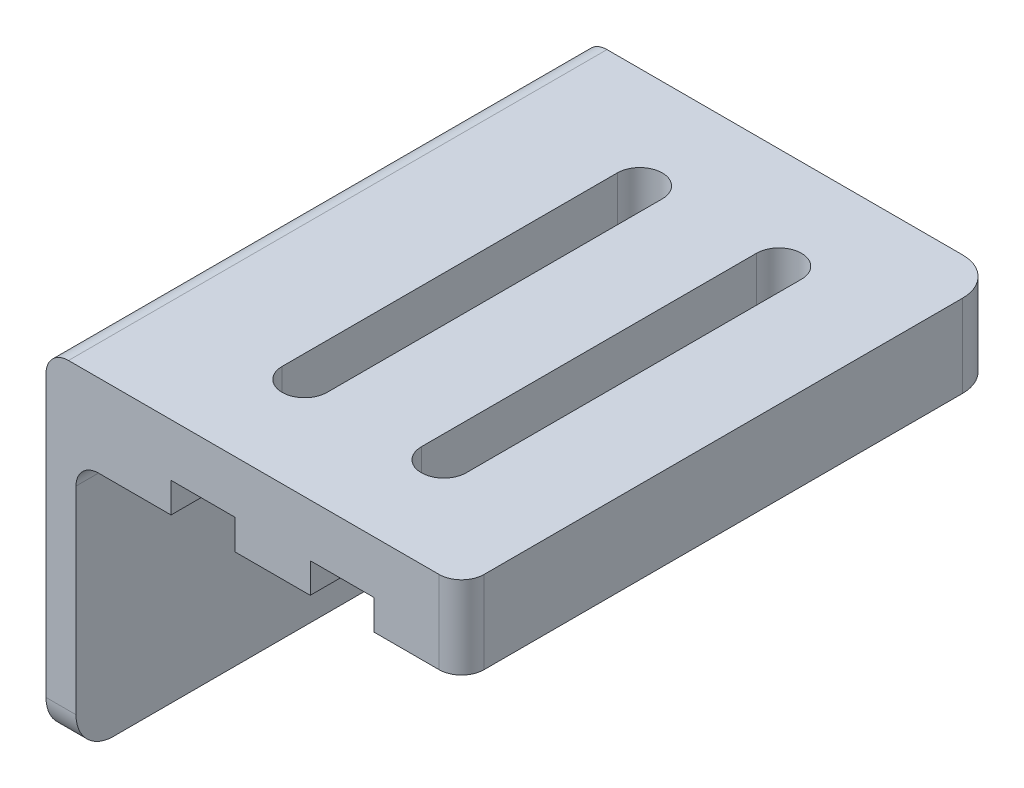
ISO-10303-21;
HEADER;
FILE_DESCRIPTION(('STEP AP214'),'2;1');
FILE_NAME('part.step','',(''),(''),'','','');
FILE_SCHEMA(('AUTOMOTIVE_DESIGN { 1 0 10303 214 1 1 1 1 }'));
ENDSEC;
DATA;
#1=APPLICATION_CONTEXT('core data for automotive mechanical design processes');
#2=APPLICATION_PROTOCOL_DEFINITION('international standard','automotive_design',2000,#1);
#3=PRODUCT_CONTEXT('',#1,'mechanical');
#4=PRODUCT('Part','Part','',(#3));
#5=PRODUCT_RELATED_PRODUCT_CATEGORY('part','',(#4));
#6=PRODUCT_DEFINITION_FORMATION('','',#4);
#7=PRODUCT_DEFINITION_CONTEXT('part definition',#1,'design');
#8=PRODUCT_DEFINITION('design','',#6,#7);
#9=PRODUCT_DEFINITION_SHAPE('','',#8);
#10=(LENGTH_UNIT() NAMED_UNIT(*) SI_UNIT(.MILLI.,.METRE.));
#11=(NAMED_UNIT(*) PLANE_ANGLE_UNIT() SI_UNIT($,.RADIAN.));
#12=(NAMED_UNIT(*) SI_UNIT($,.STERADIAN.) SOLID_ANGLE_UNIT());
#13=UNCERTAINTY_MEASURE_WITH_UNIT(LENGTH_MEASURE(1.E-05),#10,'distance_accuracy_value','');
#14=(GEOMETRIC_REPRESENTATION_CONTEXT(3) GLOBAL_UNCERTAINTY_ASSIGNED_CONTEXT((#13)) GLOBAL_UNIT_ASSIGNED_CONTEXT((#10,
#11,#12)) REPRESENTATION_CONTEXT('',''));
#15=CARTESIAN_POINT('',(0.,0.,0.));
#16=DIRECTION('',(0.,0.,1.));
#17=DIRECTION('',(1.,0.,0.));
#18=AXIS2_PLACEMENT_3D('',#15,#16,#17);
#19=CARTESIAN_POINT('',(153.6,-155.500000000001,0.));
#20=DIRECTION('',(0.,-1.,0.));
#21=DIRECTION('',(0.,0.,-1.));
#22=AXIS2_PLACEMENT_3D('',#19,#20,#21);
#23=PLANE('',#22);
#24=DIRECTION('',(1.,0.,0.));
#25=VECTOR('',#24,1.);
#26=CARTESIAN_POINT('',(144.6,-155.500000000001,56.0614389565943));
#27=LINE('',#26,#25);
#28=CARTESIAN_POINT('',(96.2,-155.500000000001,56.0614389565943));
#29=VERTEX_POINT('',#28);
#30=CARTESIAN_POINT('',(105.872209529196,-155.500000000001,56.0614389565944));
#31=VERTEX_POINT('',#30);
#32=EDGE_CURVE('E419',#29,#31,#27,.T.);
#33=ORIENTED_EDGE('',*,*,#32,.F.);
#34=DIRECTION('',(0.,0.,1.));
#35=VECTOR('',#34,1.);
#36=CARTESIAN_POINT('',(96.2,-155.500000000001,0.));
#37=LINE('',#36,#35);
#38=CARTESIAN_POINT('',(96.2,-155.500000000001,-15.7255205945389));
#39=VERTEX_POINT('',#38);
#40=EDGE_CURVE('E443',#29,#39,#37,.F.);
#41=ORIENTED_EDGE('',*,*,#40,.T.);
#42=DIRECTION('',(-1.,0.,0.));
#43=VECTOR('',#42,1.);
#44=CARTESIAN_POINT('',(153.6,-155.500000000001,-15.7255205945389));
#45=LINE('',#44,#43);
#46=CARTESIAN_POINT('',(105.872209529196,-155.500000000001,-15.7255205945389));
#47=VERTEX_POINT('',#46);
#48=EDGE_CURVE('E429',#47,#39,#45,.T.);
#49=ORIENTED_EDGE('',*,*,#48,.F.);
#50=DIRECTION('',(0.,0.,-1.));
#51=VECTOR('',#50,1.);
#52=CARTESIAN_POINT('',(105.872209529196,-155.500000000001,56.0614389565944));
#53=LINE('',#52,#51);
#54=EDGE_CURVE('E370',#31,#47,#53,.T.);
#55=ORIENTED_EDGE('',*,*,#54,.F.);
#56=EDGE_LOOP('',(#33,#41,#49,#55));
#57=FACE_BOUND('',#56,.T.);
#58=ADVANCED_FACE('F34',(#57),#23,.T.);
#59=CARTESIAN_POINT('',(93.2,0.,0.));
#60=DIRECTION('',(-1.,0.,0.));
#61=DIRECTION('',(0.,0.,1.));
#62=AXIS2_PLACEMENT_3D('',#59,#60,#61);
#63=PLANE('',#62);
#64=DIRECTION('',(0.,1.,0.));
#65=VECTOR('',#64,1.);
#66=CARTESIAN_POINT('',(93.2,-155.500000000001,56.0614389565943));
#67=LINE('',#66,#65);
#68=CARTESIAN_POINT('',(93.2,-184.900000000001,56.0614389565943));
#69=VERTEX_POINT('',#68);
#70=CARTESIAN_POINT('',(93.2,-158.500000000001,56.0614389565943));
#71=VERTEX_POINT('',#70);
#72=EDGE_CURVE('E296',#69,#71,#67,.T.);
#73=ORIENTED_EDGE('',*,*,#72,.F.);
#74=CARTESIAN_POINT('',(93.2,-184.900000000001,51.0614389565943));
#75=DIRECTION('',(-1.,0.,0.));
#76=DIRECTION('',(0.,0.,1.));
#77=AXIS2_PLACEMENT_3D('',#74,#75,#76);
#78=CIRCLE('',#77,5.);
#79=CARTESIAN_POINT('',(93.2,-189.900000000001,51.0614389565943));
#80=VERTEX_POINT('',#79);
#81=EDGE_CURVE('E42',#69,#80,#78,.F.);
#82=ORIENTED_EDGE('',*,*,#81,.T.);
#83=DIRECTION('',(0.,0.,1.));
#84=VECTOR('',#83,1.);
#85=CARTESIAN_POINT('',(93.2,-189.900000000001,26.2410464962216));
#86=LINE('',#85,#84);
#87=CARTESIAN_POINT('',(93.2,-189.900000000001,-10.7255205945389));
#88=VERTEX_POINT('',#87);
#89=EDGE_CURVE('E298',#88,#80,#86,.T.);
#90=ORIENTED_EDGE('',*,*,#89,.F.);
#91=CARTESIAN_POINT('',(93.2,-184.900000000001,-10.7255205945389));
#92=DIRECTION('',(-1.,0.,0.));
#93=DIRECTION('',(0.,0.,1.));
#94=AXIS2_PLACEMENT_3D('',#91,#92,#93);
#95=CIRCLE('',#94,5.);
#96=CARTESIAN_POINT('',(93.2,-184.900000000001,-15.7255205945389));
#97=VERTEX_POINT('',#96);
#98=EDGE_CURVE('E49',#88,#97,#95,.F.);
#99=ORIENTED_EDGE('',*,*,#98,.T.);
#100=DIRECTION('',(0.,1.,0.));
#101=VECTOR('',#100,1.);
#102=CARTESIAN_POINT('',(93.2,0.,-15.7255205945389));
#103=LINE('',#102,#101);
#104=CARTESIAN_POINT('',(93.2,-158.500000000001,-15.7255205945389));
#105=VERTEX_POINT('',#104);
#106=EDGE_CURVE('E432',#97,#105,#103,.T.);
#107=ORIENTED_EDGE('',*,*,#106,.T.);
#108=DIRECTION('',(0.,0.,1.));
#109=VECTOR('',#108,1.);
#110=CARTESIAN_POINT('',(93.2,-158.500000000001,0.));
#111=LINE('',#110,#109);
#112=EDGE_CURVE('E440',#105,#71,#111,.T.);
#113=ORIENTED_EDGE('',*,*,#112,.T.);
#114=EDGE_LOOP('',(#73,#82,#90,#99,#107,#113));
#115=FACE_BOUND('',#114,.T.);
#116=DIRECTION('',(0.,1.,0.));
#117=VECTOR('',#116,1.);
#118=CARTESIAN_POINT('',(93.2,0.,9.25776295084135));
#119=LINE('',#118,#117);
#120=CARTESIAN_POINT('',(93.2,-179.290104899113,9.25776295084138));
#121=VERTEX_POINT('',#120);
#122=CARTESIAN_POINT('',(93.2,-168.408548591911,9.25776295084138));
#123=VERTEX_POINT('',#122);
#124=EDGE_CURVE('E267',#121,#123,#119,.T.);
#125=ORIENTED_EDGE('',*,*,#124,.T.);
#126=CARTESIAN_POINT('',(93.2,-168.408548591911,5.25776295084138));
#127=DIRECTION('',(-1.,0.,0.));
#128=DIRECTION('',(0.,0.,1.));
#129=AXIS2_PLACEMENT_3D('',#126,#127,#128);
#130=CIRCLE('',#129,4.);
#131=CARTESIAN_POINT('',(93.2,-168.408548591911,1.25776295084138));
#132=VERTEX_POINT('',#131);
#133=EDGE_CURVE('E261',#123,#132,#130,.T.);
#134=ORIENTED_EDGE('',*,*,#133,.T.);
#135=DIRECTION('',(0.,-1.,0.));
#136=VECTOR('',#135,1.);
#137=CARTESIAN_POINT('',(93.2,0.,1.25776295084134));
#138=LINE('',#137,#136);
#139=CARTESIAN_POINT('',(93.2,-179.290104899113,1.25776295084138));
#140=VERTEX_POINT('',#139);
#141=EDGE_CURVE('E243',#132,#140,#138,.T.);
#142=ORIENTED_EDGE('',*,*,#141,.T.);
#143=CARTESIAN_POINT('',(93.2,-179.290104899113,5.25776295084138));
#144=DIRECTION('',(-1.,0.,0.));
#145=DIRECTION('',(0.,0.,1.));
#146=AXIS2_PLACEMENT_3D('',#143,#144,#145);
#147=CIRCLE('',#146,4.);
#148=EDGE_CURVE('E253',#140,#121,#147,.T.);
#149=ORIENTED_EDGE('',*,*,#148,.T.);
#150=EDGE_LOOP('',(#125,#134,#142,#149));
#151=FACE_BOUND('',#150,.T.);
#152=ADVANCED_FACE('F266',(#115,#151),#63,.F.);
#153=DIRECTION('',(0.,0.,-1.));
#154=VECTOR('',#153,1.);
#155=CARTESIAN_POINT('',(124.427790470804,-155.500000000001,56.0614389565944));
#156=LINE('',#155,#154);
#157=CARTESIAN_POINT('',(124.427790470804,-155.500000000001,56.0614389565944));
#158=VERTEX_POINT('',#157);
#159=CARTESIAN_POINT('',(124.427790470804,-155.500000000001,-15.7255205945389));
#160=VERTEX_POINT('',#159);
#161=EDGE_CURVE('E377',#158,#160,#156,.T.);
#162=ORIENTED_EDGE('',*,*,#161,.F.);
#163=CARTESIAN_POINT('',(114.372209529196,-155.500000000001,56.0614389565944));
#164=VERTEX_POINT('',#163);
#165=EDGE_CURVE('E422',#164,#158,#27,.T.);
#166=ORIENTED_EDGE('',*,*,#165,.F.);
#167=DIRECTION('',(0.,0.,-1.));
#168=VECTOR('',#167,1.);
#169=CARTESIAN_POINT('',(114.372209529196,-155.500000000001,56.0614389565944));
#170=LINE('',#169,#168);
#171=CARTESIAN_POINT('',(114.372209529196,-155.500000000001,-15.7255205945389));
#172=VERTEX_POINT('',#171);
#173=EDGE_CURVE('E398',#164,#172,#170,.T.);
#174=ORIENTED_EDGE('',*,*,#173,.T.);
#175=EDGE_CURVE('E433',#160,#172,#45,.T.);
#176=ORIENTED_EDGE('',*,*,#175,.F.);
#177=EDGE_LOOP('',(#162,#166,#174,#176));
#178=FACE_BOUND('',#177,.T.);
#179=ADVANCED_FACE('F558',(#178),#23,.T.);
#180=CARTESIAN_POINT('',(89.2,-144.500000000001,0.));
#181=DIRECTION('',(0.,1.,0.));
#182=DIRECTION('',(0.,0.,1.));
#183=AXIS2_PLACEMENT_3D('',#180,#181,#182);
#184=PLANE('',#183);
#185=DIRECTION('',(0.,0.,1.));
#186=VECTOR('',#185,1.);
#187=CARTESIAN_POINT('',(144.6,-144.500000000001,2.21200931382336));
#188=LINE('',#187,#186);
#189=CARTESIAN_POINT('',(144.6,-144.500000000001,-10.7255205945389));
#190=VERTEX_POINT('',#189);
#191=CARTESIAN_POINT('',(144.6,-144.500000000001,53.0614389565943));
#192=VERTEX_POINT('',#191);
#193=EDGE_CURVE('E427',#190,#192,#188,.T.);
#194=ORIENTED_EDGE('',*,*,#193,.F.);
#195=CARTESIAN_POINT('',(139.6,-144.500000000001,-10.7255205945389));
#196=DIRECTION('',(0.,1.,0.));
#197=DIRECTION('',(0.,0.,1.));
#198=AXIS2_PLACEMENT_3D('',#195,#196,#197);
#199=CIRCLE('',#198,5.);
#200=CARTESIAN_POINT('',(139.6,-144.500000000001,-15.7255205945389));
#201=VERTEX_POINT('',#200);
#202=EDGE_CURVE('E477',#190,#201,#199,.T.);
#203=ORIENTED_EDGE('',*,*,#202,.T.);
#204=DIRECTION('',(1.,0.,0.));
#205=VECTOR('',#204,1.);
#206=CARTESIAN_POINT('',(89.2,-144.500000000001,-15.7255205945389));
#207=LINE('',#206,#205);
#208=CARTESIAN_POINT('',(92.2,-144.500000000001,-15.7255205945389));
#209=VERTEX_POINT('',#208);
#210=EDGE_CURVE('E436',#209,#201,#207,.T.);
#211=ORIENTED_EDGE('',*,*,#210,.F.);
#212=DIRECTION('',(0.,0.,1.));
#213=VECTOR('',#212,1.);
#214=CARTESIAN_POINT('',(92.2,-144.500000000001,0.));
#215=LINE('',#214,#213);
#216=CARTESIAN_POINT('',(92.2,-144.500000000001,56.0614389565943));
#217=VERTEX_POINT('',#216);
#218=EDGE_CURVE('E458',#209,#217,#215,.T.);
#219=ORIENTED_EDGE('',*,*,#218,.T.);
#220=DIRECTION('',(1.,0.,0.));
#221=VECTOR('',#220,1.);
#222=CARTESIAN_POINT('',(144.6,-144.500000000001,56.0614389565943));
#223=LINE('',#222,#221);
#224=CARTESIAN_POINT('',(141.6,-144.500000000001,56.0614389565943));
#225=VERTEX_POINT('',#224);
#226=EDGE_CURVE('E418',#217,#225,#223,.T.);
#227=ORIENTED_EDGE('',*,*,#226,.T.);
#228=CARTESIAN_POINT('',(141.6,-144.500000000001,53.0614389565943));
#229=DIRECTION('',(0.,1.,0.));
#230=DIRECTION('',(0.,0.,1.));
#231=AXIS2_PLACEMENT_3D('',#228,#229,#230);
#232=CIRCLE('',#231,3.);
#233=EDGE_CURVE('E461',#225,#192,#232,.T.);
#234=ORIENTED_EDGE('',*,*,#233,.T.);
#235=EDGE_LOOP('',(#194,#203,#211,#219,#227,#234));
#236=FACE_BOUND('',#235,.T.);
#237=CARTESIAN_POINT('',(110.122209529196,-144.500000000001,-2.1725151429793));
#238=DIRECTION('',(0.,1.,0.));
#239=DIRECTION('',(0.,0.,1.));
#240=AXIS2_PLACEMENT_3D('',#237,#238,#239);
#241=CIRCLE('',#240,3.);
#242=CARTESIAN_POINT('',(113.122209529196,-144.500000000001,-2.1725151429793));
#243=VERTEX_POINT('',#242);
#244=CARTESIAN_POINT('',(107.122209529196,-144.500000000001,-2.17251514297931));
#245=VERTEX_POINT('',#244);
#246=EDGE_CURVE('E311',#243,#245,#241,.T.);
#247=ORIENTED_EDGE('',*,*,#246,.F.);
#248=DIRECTION('',(0.,0.,-1.));
#249=VECTOR('',#248,1.);
#250=CARTESIAN_POINT('',(113.122209529196,-144.500000000001,-2.1725151429793));
#251=LINE('',#250,#249);
#252=CARTESIAN_POINT('',(113.122209529196,-144.500000000001,42.5084335050348));
#253=VERTEX_POINT('',#252);
#254=EDGE_CURVE('E308',#253,#243,#251,.T.);
#255=ORIENTED_EDGE('',*,*,#254,.F.);
#256=CARTESIAN_POINT('',(110.122209529196,-144.500000000001,42.5084335050348));
#257=DIRECTION('',(0.,1.,0.));
#258=DIRECTION('',(0.,0.,1.));
#259=AXIS2_PLACEMENT_3D('',#256,#257,#258);
#260=CIRCLE('',#259,3.);
#261=CARTESIAN_POINT('',(107.122209529196,-144.500000000001,42.5084335050348));
#262=VERTEX_POINT('',#261);
#263=EDGE_CURVE('E317',#262,#253,#260,.T.);
#264=ORIENTED_EDGE('',*,*,#263,.F.);
#265=DIRECTION('',(0.,0.,1.));
#266=VECTOR('',#265,1.);
#267=CARTESIAN_POINT('',(107.122209529196,-144.500000000001,-2.17251514297931));
#268=LINE('',#267,#266);
#269=EDGE_CURVE('E320',#245,#262,#268,.T.);
#270=ORIENTED_EDGE('',*,*,#269,.F.);
#271=EDGE_LOOP('',(#247,#255,#264,#270));
#272=FACE_BOUND('',#271,.T.);
#273=CARTESIAN_POINT('',(128.677790470804,-144.500000000001,-2.17251514297931));
#274=DIRECTION('',(0.,1.,0.));
#275=DIRECTION('',(0.,0.,-1.));
#276=AXIS2_PLACEMENT_3D('',#273,#274,#275);
#277=CIRCLE('',#276,3.);
#278=CARTESIAN_POINT('',(131.677790470804,-144.500000000001,-2.17251514297931));
#279=VERTEX_POINT('',#278);
#280=CARTESIAN_POINT('',(125.677790470804,-144.500000000001,-2.17251514297931));
#281=VERTEX_POINT('',#280);
#282=EDGE_CURVE('E344',#279,#281,#277,.T.);
#283=ORIENTED_EDGE('',*,*,#282,.F.);
#284=DIRECTION('',(0.,0.,-1.));
#285=VECTOR('',#284,1.);
#286=CARTESIAN_POINT('',(131.677790470804,-144.500000000001,-2.17251514297931));
#287=LINE('',#286,#285);
#288=CARTESIAN_POINT('',(131.677790470804,-144.500000000001,42.5084335050348));
#289=VERTEX_POINT('',#288);
#290=EDGE_CURVE('E341',#289,#279,#287,.T.);
#291=ORIENTED_EDGE('',*,*,#290,.F.);
#292=CARTESIAN_POINT('',(128.677790470804,-144.500000000001,42.5084335050348));
#293=DIRECTION('',(0.,1.,0.));
#294=DIRECTION('',(0.,0.,-1.));
#295=AXIS2_PLACEMENT_3D('',#292,#293,#294);
#296=CIRCLE('',#295,3.);
#297=CARTESIAN_POINT('',(125.677790470804,-144.500000000001,42.5084335050348));
#298=VERTEX_POINT('',#297);
#299=EDGE_CURVE('E350',#298,#289,#296,.T.);
#300=ORIENTED_EDGE('',*,*,#299,.F.);
#301=DIRECTION('',(0.,0.,1.));
#302=VECTOR('',#301,1.);
#303=CARTESIAN_POINT('',(125.677790470804,-144.500000000001,-2.17251514297931));
#304=LINE('',#303,#302);
#305=EDGE_CURVE('E353',#281,#298,#304,.T.);
#306=ORIENTED_EDGE('',*,*,#305,.F.);
#307=EDGE_LOOP('',(#283,#291,#300,#306));
#308=FACE_BOUND('',#307,.T.);
#309=ADVANCED_FACE('F572',(#236,#272,#308),#184,.T.);
#310=CARTESIAN_POINT('',(89.2,0.,-15.7255205945389));
#311=DIRECTION('',(0.,0.,-1.));
#312=DIRECTION('',(-1.,0.,0.));
#313=AXIS2_PLACEMENT_3D('',#310,#311,#312);
#314=PLANE('',#313);
#315=ORIENTED_EDGE('',*,*,#106,.F.);
#316=DIRECTION('',(1.,0.,0.));
#317=VECTOR('',#316,1.);
#318=CARTESIAN_POINT('',(89.2,-184.900000000001,-15.7255205945389));
#319=LINE('',#318,#317);
#320=CARTESIAN_POINT('',(89.2,-184.900000000001,-15.7255205945389));
#321=VERTEX_POINT('',#320);
#322=EDGE_CURVE('E11',#97,#321,#319,.F.);
#323=ORIENTED_EDGE('',*,*,#322,.T.);
#324=DIRECTION('',(0.,1.,0.));
#325=VECTOR('',#324,1.);
#326=CARTESIAN_POINT('',(89.2,0.,-15.7255205945389));
#327=LINE('',#326,#325);
#328=CARTESIAN_POINT('',(89.2,-147.500000000001,-15.7255205945389));
#329=VERTEX_POINT('',#328);
#330=EDGE_CURVE('E434',#321,#329,#327,.T.);
#331=ORIENTED_EDGE('',*,*,#330,.T.);
#332=CARTESIAN_POINT('',(92.2,-147.500000000001,-15.7255205945389));
#333=DIRECTION('',(0.,0.,-1.));
#334=DIRECTION('',(-1.,0.,0.));
#335=AXIS2_PLACEMENT_3D('',#332,#333,#334);
#336=CIRCLE('',#335,3.);
#337=EDGE_CURVE('E472',#329,#209,#336,.T.);
#338=ORIENTED_EDGE('',*,*,#337,.T.);
#339=ORIENTED_EDGE('',*,*,#210,.T.);
#340=DIRECTION('',(0.,1.,0.));
#341=VECTOR('',#340,1.);
#342=CARTESIAN_POINT('',(139.6,-155.500000000001,-15.7255205945389));
#343=LINE('',#342,#341);
#344=CARTESIAN_POINT('',(139.6,-155.500000000001,-15.7255205945389));
#345=VERTEX_POINT('',#344);
#346=EDGE_CURVE('E479',#201,#345,#343,.F.);
#347=ORIENTED_EDGE('',*,*,#346,.T.);
#348=CARTESIAN_POINT('',(132.927790470804,-155.500000000001,-15.7255205945389));
#349=VERTEX_POINT('',#348);
#350=EDGE_CURVE('E430',#345,#349,#45,.T.);
#351=ORIENTED_EDGE('',*,*,#350,.T.);
#352=DIRECTION('',(0.,-1.,0.));
#353=VECTOR('',#352,1.);
#354=CARTESIAN_POINT('',(132.927790470804,0.,-15.7255205945389));
#355=LINE('',#354,#353);
#356=CARTESIAN_POINT('',(132.927790470804,-151.500000000001,-15.7255205945389));
#357=VERTEX_POINT('',#356);
#358=EDGE_CURVE('E413',#357,#349,#355,.T.);
#359=ORIENTED_EDGE('',*,*,#358,.F.);
#360=DIRECTION('',(1.,0.,0.));
#361=VECTOR('',#360,1.);
#362=CARTESIAN_POINT('',(89.2,-151.500000000001,-15.7255205945389));
#363=LINE('',#362,#361);
#364=CARTESIAN_POINT('',(124.427790470804,-151.500000000001,-15.7255205945389));
#365=VERTEX_POINT('',#364);
#366=EDGE_CURVE('E411',#365,#357,#363,.T.);
#367=ORIENTED_EDGE('',*,*,#366,.F.);
#368=DIRECTION('',(0.,1.,0.));
#369=VECTOR('',#368,1.);
#370=CARTESIAN_POINT('',(124.427790470804,0.,-15.7255205945389));
#371=LINE('',#370,#369);
#372=EDGE_CURVE('E416',#160,#365,#371,.T.);
#373=ORIENTED_EDGE('',*,*,#372,.F.);
#374=ORIENTED_EDGE('',*,*,#175,.T.);
#375=DIRECTION('',(0.,-1.,0.));
#376=VECTOR('',#375,1.);
#377=CARTESIAN_POINT('',(114.372209529196,0.,-15.7255205945389));
#378=LINE('',#377,#376);
#379=CARTESIAN_POINT('',(114.372209529196,-151.500000000001,-15.7255205945389));
#380=VERTEX_POINT('',#379);
#381=EDGE_CURVE('E407',#380,#172,#378,.T.);
#382=ORIENTED_EDGE('',*,*,#381,.F.);
#383=DIRECTION('',(1.,0.,0.));
#384=VECTOR('',#383,1.);
#385=CARTESIAN_POINT('',(89.2,-151.500000000001,-15.7255205945389));
#386=LINE('',#385,#384);
#387=CARTESIAN_POINT('',(105.872209529196,-151.500000000001,-15.7255205945389));
#388=VERTEX_POINT('',#387);
#389=EDGE_CURVE('E379',#388,#380,#386,.T.);
#390=ORIENTED_EDGE('',*,*,#389,.F.);
#391=DIRECTION('',(0.,1.,0.));
#392=VECTOR('',#391,1.);
#393=CARTESIAN_POINT('',(105.872209529196,0.,-15.7255205945389));
#394=LINE('',#393,#392);
#395=EDGE_CURVE('E409',#47,#388,#394,.T.);
#396=ORIENTED_EDGE('',*,*,#395,.F.);
#397=ORIENTED_EDGE('',*,*,#48,.T.);
#398=CARTESIAN_POINT('',(96.2,-158.500000000001,-15.7255205945389));
#399=DIRECTION('',(0.,0.,-1.));
#400=DIRECTION('',(-1.,0.,0.));
#401=AXIS2_PLACEMENT_3D('',#398,#399,#400);
#402=CIRCLE('',#401,3.);
#403=EDGE_CURVE('E446',#39,#105,#402,.F.);
#404=ORIENTED_EDGE('',*,*,#403,.T.);
#405=EDGE_LOOP('',(#315,#323,#331,#338,#339,#347,#351,#359,#367,#373,#374,#382,#390,#396,#397,#404));
#406=FACE_BOUND('',#405,.T.);
#407=ADVANCED_FACE('F531',(#406),#314,.T.);
#408=CARTESIAN_POINT('',(89.2,0.,0.));
#409=DIRECTION('',(-1.,0.,0.));
#410=DIRECTION('',(0.,0.,1.));
#411=AXIS2_PLACEMENT_3D('',#408,#409,#410);
#412=PLANE('',#411);
#413=DIRECTION('',(0.,0.,1.));
#414=VECTOR('',#413,1.);
#415=CARTESIAN_POINT('',(89.2,-189.900000000001,26.2410464962216));
#416=LINE('',#415,#414);
#417=CARTESIAN_POINT('',(89.2,-189.900000000001,-10.7255205945389));
#418=VERTEX_POINT('',#417);
#419=CARTESIAN_POINT('',(89.2,-189.900000000001,51.0614389565943));
#420=VERTEX_POINT('',#419);
#421=EDGE_CURVE('E271',#418,#420,#416,.T.);
#422=ORIENTED_EDGE('',*,*,#421,.T.);
#423=CARTESIAN_POINT('',(89.2,-184.900000000001,51.0614389565943));
#424=DIRECTION('',(-1.,0.,0.));
#425=DIRECTION('',(0.,0.,1.));
#426=AXIS2_PLACEMENT_3D('',#423,#424,#425);
#427=CIRCLE('',#426,5.);
#428=CARTESIAN_POINT('',(89.2,-184.900000000001,56.0614389565943));
#429=VERTEX_POINT('',#428);
#430=EDGE_CURVE('E505',#420,#429,#427,.T.);
#431=ORIENTED_EDGE('',*,*,#430,.T.);
#432=DIRECTION('',(0.,1.,0.));
#433=VECTOR('',#432,1.);
#434=CARTESIAN_POINT('',(89.2,-155.500000000001,56.0614389565943));
#435=LINE('',#434,#433);
#436=CARTESIAN_POINT('',(89.2,-147.500000000001,56.0614389565943));
#437=VERTEX_POINT('',#436);
#438=EDGE_CURVE('E421',#429,#437,#435,.T.);
#439=ORIENTED_EDGE('',*,*,#438,.T.);
#440=DIRECTION('',(0.,0.,1.));
#441=VECTOR('',#440,1.);
#442=CARTESIAN_POINT('',(89.2,-147.500000000001,0.));
#443=LINE('',#442,#441);
#444=EDGE_CURVE('E469',#437,#329,#443,.F.);
#445=ORIENTED_EDGE('',*,*,#444,.T.);
#446=ORIENTED_EDGE('',*,*,#330,.F.);
#447=CARTESIAN_POINT('',(89.2,-184.900000000001,-10.7255205945389));
#448=DIRECTION('',(-1.,0.,0.));
#449=DIRECTION('',(0.,0.,1.));
#450=AXIS2_PLACEMENT_3D('',#447,#448,#449);
#451=CIRCLE('',#450,5.);
#452=EDGE_CURVE('E503',#321,#418,#451,.T.);
#453=ORIENTED_EDGE('',*,*,#452,.T.);
#454=EDGE_LOOP('',(#422,#431,#439,#445,#446,#453));
#455=FACE_BOUND('',#454,.T.);
#456=CARTESIAN_POINT('',(89.2,-168.408548591911,5.25776295084138));
#457=DIRECTION('',(-1.,0.,0.));
#458=DIRECTION('',(0.,0.,1.));
#459=AXIS2_PLACEMENT_3D('',#456,#457,#458);
#460=CIRCLE('',#459,4.);
#461=CARTESIAN_POINT('',(89.199994,-168.408548591911,9.25776295084138));
#462=VERTEX_POINT('',#461);
#463=CARTESIAN_POINT('',(89.199994,-168.408548591911,1.25776295084138));
#464=VERTEX_POINT('',#463);
#465=EDGE_CURVE('E264',#462,#464,#460,.T.);
#466=ORIENTED_EDGE('',*,*,#465,.F.);
#467=DIRECTION('',(0.,1.,0.));
#468=VECTOR('',#467,1.);
#469=CARTESIAN_POINT('',(89.2,0.,9.25776295084135));
#470=LINE('',#469,#468);
#471=CARTESIAN_POINT('',(89.199994,-179.290104899113,9.25776295084138));
#472=VERTEX_POINT('',#471);
#473=EDGE_CURVE('E493',#472,#462,#470,.T.);
#474=ORIENTED_EDGE('',*,*,#473,.F.);
#475=CARTESIAN_POINT('',(89.2,-179.290104899113,5.25776295084138));
#476=DIRECTION('',(-1.,0.,0.));
#477=DIRECTION('',(0.,0.,1.));
#478=AXIS2_PLACEMENT_3D('',#475,#476,#477);
#479=CIRCLE('',#478,4.);
#480=CARTESIAN_POINT('',(89.199994,-179.290104899113,1.25776295084138));
#481=VERTEX_POINT('',#480);
#482=EDGE_CURVE('E288',#481,#472,#479,.T.);
#483=ORIENTED_EDGE('',*,*,#482,.F.);
#484=DIRECTION('',(0.,-1.,0.));
#485=VECTOR('',#484,1.);
#486=CARTESIAN_POINT('',(89.2,0.,1.25776295084134));
#487=LINE('',#486,#485);
#488=EDGE_CURVE('E483',#464,#481,#487,.T.);
#489=ORIENTED_EDGE('',*,*,#488,.F.);
#490=EDGE_LOOP('',(#466,#474,#483,#489));
#491=FACE_BOUND('',#490,.T.);
#492=ADVANCED_FACE('F517',(#455,#491),#412,.T.);
#493=ORIENTED_EDGE('',*,*,#350,.F.);
#494=CARTESIAN_POINT('',(139.6,-155.500000000001,-10.7255205945389));
#495=DIRECTION('',(0.,-1.,0.));
#496=DIRECTION('',(0.,0.,-1.));
#497=AXIS2_PLACEMENT_3D('',#494,#495,#496);
#498=CIRCLE('',#497,5.);
#499=CARTESIAN_POINT('',(144.6,-155.500000000001,-10.7255205945389));
#500=VERTEX_POINT('',#499);
#501=EDGE_CURVE('E481',#345,#500,#498,.T.);
#502=ORIENTED_EDGE('',*,*,#501,.T.);
#503=DIRECTION('',(0.,0.,-1.));
#504=VECTOR('',#503,1.);
#505=CARTESIAN_POINT('',(144.6,-155.500000000001,0.));
#506=LINE('',#505,#504);
#507=CARTESIAN_POINT('',(144.6,-155.500000000001,53.0614389565943));
#508=VERTEX_POINT('',#507);
#509=EDGE_CURVE('E449',#508,#500,#506,.T.);
#510=ORIENTED_EDGE('',*,*,#509,.F.);
#511=CARTESIAN_POINT('',(141.6,-155.500000000001,53.0614389565943));
#512=DIRECTION('',(0.,-1.,0.));
#513=DIRECTION('',(0.,0.,-1.));
#514=AXIS2_PLACEMENT_3D('',#511,#512,#513);
#515=CIRCLE('',#514,3.);
#516=CARTESIAN_POINT('',(141.6,-155.500000000001,56.0614389565943));
#517=VERTEX_POINT('',#516);
#518=EDGE_CURVE('E466',#508,#517,#515,.T.);
#519=ORIENTED_EDGE('',*,*,#518,.T.);
#520=CARTESIAN_POINT('',(132.927790470804,-155.500000000001,56.0614389565944));
#521=VERTEX_POINT('',#520);
#522=EDGE_CURVE('E423',#521,#517,#27,.T.);
#523=ORIENTED_EDGE('',*,*,#522,.F.);
#524=DIRECTION('',(0.,0.,-1.));
#525=VECTOR('',#524,1.);
#526=CARTESIAN_POINT('',(132.927790470804,-155.500000000001,56.0614389565944));
#527=LINE('',#526,#525);
#528=EDGE_CURVE('E380',#521,#349,#527,.T.);
#529=ORIENTED_EDGE('',*,*,#528,.T.);
#530=EDGE_LOOP('',(#493,#502,#510,#519,#523,#529));
#531=FACE_BOUND('',#530,.T.);
#532=ADVANCED_FACE('F566',(#531),#23,.T.);
#533=CARTESIAN_POINT('',(96.2,-158.500000000001,0.));
#534=DIRECTION('',(0.,0.,1.));
#535=DIRECTION('',(1.,0.,0.));
#536=AXIS2_PLACEMENT_3D('',#533,#534,#535);
#537=CYLINDRICAL_SURFACE('',#536,3.);
#538=ORIENTED_EDGE('',*,*,#403,.F.);
#539=ORIENTED_EDGE('',*,*,#40,.F.);
#540=CARTESIAN_POINT('',(96.2,-158.500000000001,56.0614389565943));
#541=DIRECTION('',(0.,0.,1.));
#542=DIRECTION('',(1.,0.,0.));
#543=AXIS2_PLACEMENT_3D('',#540,#541,#542);
#544=CIRCLE('',#543,3.);
#545=EDGE_CURVE('E268',#71,#29,#544,.F.);
#546=ORIENTED_EDGE('',*,*,#545,.F.);
#547=ORIENTED_EDGE('',*,*,#112,.F.);
#548=EDGE_LOOP('',(#538,#539,#546,#547));
#549=FACE_BOUND('',#548,.T.);
#550=ADVANCED_FACE('F536',(#549),#537,.F.);
#551=CARTESIAN_POINT('',(144.6,-144.500000000001,2.21200931382336));
#552=DIRECTION('',(-1.,0.,0.));
#553=DIRECTION('',(0.,0.,1.));
#554=AXIS2_PLACEMENT_3D('',#551,#552,#553);
#555=PLANE('',#554);
#556=ORIENTED_EDGE('',*,*,#509,.T.);
#557=DIRECTION('',(0.,1.,0.));
#558=VECTOR('',#557,1.);
#559=CARTESIAN_POINT('',(144.6,-144.500000000001,-10.7255205945389));
#560=LINE('',#559,#558);
#561=EDGE_CURVE('E474',#500,#190,#560,.T.);
#562=ORIENTED_EDGE('',*,*,#561,.T.);
#563=ORIENTED_EDGE('',*,*,#193,.T.);
#564=DIRECTION('',(0.,1.,0.));
#565=VECTOR('',#564,1.);
#566=CARTESIAN_POINT('',(144.6,-155.500000000001,53.0614389565943));
#567=LINE('',#566,#565);
#568=EDGE_CURVE('E464',#192,#508,#567,.F.);
#569=ORIENTED_EDGE('',*,*,#568,.T.);
#570=EDGE_LOOP('',(#556,#562,#563,#569));
#571=FACE_BOUND('',#570,.T.);
#572=ADVANCED_FACE('F581',(#571),#555,.F.);
#573=CARTESIAN_POINT('',(144.6,-155.500000000001,56.0614389565943));
#574=DIRECTION('',(0.,0.,1.));
#575=DIRECTION('',(1.,0.,0.));
#576=AXIS2_PLACEMENT_3D('',#573,#574,#575);
#577=PLANE('',#576);
#578=ORIENTED_EDGE('',*,*,#438,.F.);
#579=DIRECTION('',(-1.,0.,0.));
#580=VECTOR('',#579,1.);
#581=CARTESIAN_POINT('',(144.6,-184.900000000001,56.0614389565943));
#582=LINE('',#581,#580);
#583=EDGE_CURVE('E57',#429,#69,#582,.F.);
#584=ORIENTED_EDGE('',*,*,#583,.T.);
#585=ORIENTED_EDGE('',*,*,#72,.T.);
#586=ORIENTED_EDGE('',*,*,#545,.T.);
#587=ORIENTED_EDGE('',*,*,#32,.T.);
#588=DIRECTION('',(0.,1.,0.));
#589=VECTOR('',#588,1.);
#590=CARTESIAN_POINT('',(105.872209529196,-155.500000000001,56.0614389565944));
#591=LINE('',#590,#589);
#592=CARTESIAN_POINT('',(105.872209529196,-151.500000000001,56.0614389565944));
#593=VERTEX_POINT('',#592);
#594=EDGE_CURVE('E331',#31,#593,#591,.T.);
#595=ORIENTED_EDGE('',*,*,#594,.T.);
#596=DIRECTION('',(1.,0.,0.));
#597=VECTOR('',#596,1.);
#598=CARTESIAN_POINT('',(105.872209529196,-151.500000000001,56.0614389565944));
#599=LINE('',#598,#597);
#600=CARTESIAN_POINT('',(114.372209529196,-151.500000000001,56.0614389565943));
#601=VERTEX_POINT('',#600);
#602=EDGE_CURVE('E390',#593,#601,#599,.T.);
#603=ORIENTED_EDGE('',*,*,#602,.T.);
#604=DIRECTION('',(0.,-1.,0.));
#605=VECTOR('',#604,1.);
#606=CARTESIAN_POINT('',(114.372209529196,-155.500000000001,56.0614389565944));
#607=LINE('',#606,#605);
#608=EDGE_CURVE('E393',#601,#164,#607,.T.);
#609=ORIENTED_EDGE('',*,*,#608,.T.);
#610=ORIENTED_EDGE('',*,*,#165,.T.);
#611=DIRECTION('',(0.,1.,0.));
#612=VECTOR('',#611,1.);
#613=CARTESIAN_POINT('',(124.427790470804,-155.500000000001,56.0614389565944));
#614=LINE('',#613,#612);
#615=CARTESIAN_POINT('',(124.427790470804,-151.500000000001,56.0614389565944));
#616=VERTEX_POINT('',#615);
#617=EDGE_CURVE('E366',#158,#616,#614,.T.);
#618=ORIENTED_EDGE('',*,*,#617,.T.);
#619=DIRECTION('',(1.,0.,0.));
#620=VECTOR('',#619,1.);
#621=CARTESIAN_POINT('',(132.927790470804,-151.500000000001,56.0614389565944));
#622=LINE('',#621,#620);
#623=CARTESIAN_POINT('',(132.927790470804,-151.500000000001,56.0614389565943));
#624=VERTEX_POINT('',#623);
#625=EDGE_CURVE('E369',#616,#624,#622,.T.);
#626=ORIENTED_EDGE('',*,*,#625,.T.);
#627=DIRECTION('',(0.,-1.,0.));
#628=VECTOR('',#627,1.);
#629=CARTESIAN_POINT('',(132.927790470804,-155.500000000001,56.0614389565944));
#630=LINE('',#629,#628);
#631=EDGE_CURVE('E373',#624,#521,#630,.T.);
#632=ORIENTED_EDGE('',*,*,#631,.T.);
#633=ORIENTED_EDGE('',*,*,#522,.T.);
#634=DIRECTION('',(0.,1.,0.));
#635=VECTOR('',#634,1.);
#636=CARTESIAN_POINT('',(141.6,-144.500000000001,56.0614389565943));
#637=LINE('',#636,#635);
#638=EDGE_CURVE('E455',#517,#225,#637,.T.);
#639=ORIENTED_EDGE('',*,*,#638,.T.);
#640=ORIENTED_EDGE('',*,*,#226,.F.);
#641=CARTESIAN_POINT('',(92.2,-147.500000000001,56.0614389565943));
#642=DIRECTION('',(0.,0.,1.));
#643=DIRECTION('',(1.,0.,0.));
#644=AXIS2_PLACEMENT_3D('',#641,#642,#643);
#645=CIRCLE('',#644,3.);
#646=EDGE_CURVE('E452',#217,#437,#645,.T.);
#647=ORIENTED_EDGE('',*,*,#646,.T.);
#648=EDGE_LOOP('',(#578,#584,#585,#586,#587,#595,#603,#609,#610,#618,#626,#632,#633,#639,#640,#647));
#649=FACE_BOUND('',#648,.T.);
#650=ADVANCED_FACE('F519',(#649),#577,.T.);
#651=CARTESIAN_POINT('',(141.6,-155.500000000001,53.0614389565943));
#652=DIRECTION('',(0.,-1.,0.));
#653=DIRECTION('',(0.,0.,-1.));
#654=AXIS2_PLACEMENT_3D('',#651,#652,#653);
#655=CYLINDRICAL_SURFACE('',#654,3.);
#656=ORIENTED_EDGE('',*,*,#518,.F.);
#657=ORIENTED_EDGE('',*,*,#568,.F.);
#658=ORIENTED_EDGE('',*,*,#233,.F.);
#659=ORIENTED_EDGE('',*,*,#638,.F.);
#660=EDGE_LOOP('',(#656,#657,#658,#659));
#661=FACE_BOUND('',#660,.T.);
#662=ADVANCED_FACE('F569',(#661),#655,.T.);
#663=CARTESIAN_POINT('',(92.2,-147.500000000001,0.));
#664=DIRECTION('',(0.,0.,1.));
#665=DIRECTION('',(1.,0.,0.));
#666=AXIS2_PLACEMENT_3D('',#663,#664,#665);
#667=CYLINDRICAL_SURFACE('',#666,3.);
#668=ORIENTED_EDGE('',*,*,#337,.F.);
#669=ORIENTED_EDGE('',*,*,#444,.F.);
#670=ORIENTED_EDGE('',*,*,#646,.F.);
#671=ORIENTED_EDGE('',*,*,#218,.F.);
#672=EDGE_LOOP('',(#668,#669,#670,#671));
#673=FACE_BOUND('',#672,.T.);
#674=ADVANCED_FACE('F525',(#673),#667,.T.);
#675=CARTESIAN_POINT('',(105.872209529196,-155.500000000001,56.0614389565944));
#676=DIRECTION('',(-1.,0.,0.));
#677=DIRECTION('',(0.,0.,1.));
#678=AXIS2_PLACEMENT_3D('',#675,#676,#677);
#679=PLANE('',#678);
#680=ORIENTED_EDGE('',*,*,#395,.T.);
#681=DIRECTION('',(0.,0.,-1.));
#682=VECTOR('',#681,1.);
#683=CARTESIAN_POINT('',(105.872209529196,-151.500000000001,56.0614389565944));
#684=LINE('',#683,#682);
#685=EDGE_CURVE('E396',#593,#388,#684,.T.);
#686=ORIENTED_EDGE('',*,*,#685,.F.);
#687=ORIENTED_EDGE('',*,*,#594,.F.);
#688=ORIENTED_EDGE('',*,*,#54,.T.);
#689=EDGE_LOOP('',(#680,#686,#687,#688));
#690=FACE_BOUND('',#689,.T.);
#691=ADVANCED_FACE('F544',(#690),#679,.F.);
#692=CARTESIAN_POINT('',(114.372209529196,-155.500000000001,56.0614389565944));
#693=DIRECTION('',(1.,0.,0.));
#694=DIRECTION('',(0.,0.,-1.));
#695=AXIS2_PLACEMENT_3D('',#692,#693,#694);
#696=PLANE('',#695);
#697=ORIENTED_EDGE('',*,*,#381,.T.);
#698=ORIENTED_EDGE('',*,*,#173,.F.);
#699=ORIENTED_EDGE('',*,*,#608,.F.);
#700=DIRECTION('',(0.,0.,-1.));
#701=VECTOR('',#700,1.);
#702=CARTESIAN_POINT('',(114.372209529196,-151.500000000001,56.0614389565944));
#703=LINE('',#702,#701);
#704=EDGE_CURVE('E401',#601,#380,#703,.T.);
#705=ORIENTED_EDGE('',*,*,#704,.T.);
#706=EDGE_LOOP('',(#697,#698,#699,#705));
#707=FACE_BOUND('',#706,.T.);
#708=ADVANCED_FACE('F553',(#707),#696,.F.);
#709=CARTESIAN_POINT('',(105.872209529196,-151.500000000001,56.0614389565944));
#710=DIRECTION('',(0.,1.,0.));
#711=DIRECTION('',(0.,0.,1.));
#712=AXIS2_PLACEMENT_3D('',#709,#710,#711);
#713=PLANE('',#712);
#714=DIRECTION('',(0.,0.,1.));
#715=VECTOR('',#714,1.);
#716=CARTESIAN_POINT('',(113.122209529196,-151.500000000001,-2.1725151429793));
#717=LINE('',#716,#715);
#718=CARTESIAN_POINT('',(113.122209529196,-151.500000000001,-2.1725151429793));
#719=VERTEX_POINT('',#718);
#720=CARTESIAN_POINT('',(113.122209529196,-151.500000000001,42.5084335050348));
#721=VERTEX_POINT('',#720);
#722=EDGE_CURVE('E326',#719,#721,#717,.T.);
#723=ORIENTED_EDGE('',*,*,#722,.F.);
#724=CARTESIAN_POINT('',(110.122209529196,-151.500000000001,-2.1725151429793));
#725=DIRECTION('',(0.,1.,0.));
#726=DIRECTION('',(0.,0.,1.));
#727=AXIS2_PLACEMENT_3D('',#724,#725,#726);
#728=CIRCLE('',#727,3.);
#729=CARTESIAN_POINT('',(107.122209529196,-151.500000000001,-2.17251514297931));
#730=VERTEX_POINT('',#729);
#731=EDGE_CURVE('E307',#730,#719,#728,.F.);
#732=ORIENTED_EDGE('',*,*,#731,.F.);
#733=DIRECTION('',(0.,0.,-1.));
#734=VECTOR('',#733,1.);
#735=CARTESIAN_POINT('',(107.122209529196,-151.500000000001,-2.17251514297931));
#736=LINE('',#735,#734);
#737=CARTESIAN_POINT('',(107.122209529196,-151.500000000001,42.5084335050348));
#738=VERTEX_POINT('',#737);
#739=EDGE_CURVE('E304',#738,#730,#736,.T.);
#740=ORIENTED_EDGE('',*,*,#739,.F.);
#741=CARTESIAN_POINT('',(110.122209529196,-151.500000000001,42.5084335050348));
#742=DIRECTION('',(0.,1.,0.));
#743=DIRECTION('',(0.,0.,1.));
#744=AXIS2_PLACEMENT_3D('',#741,#742,#743);
#745=CIRCLE('',#744,3.);
#746=EDGE_CURVE('E329',#721,#738,#745,.F.);
#747=ORIENTED_EDGE('',*,*,#746,.F.);
#748=EDGE_LOOP('',(#723,#732,#740,#747));
#749=FACE_BOUND('',#748,.T.);
#750=ORIENTED_EDGE('',*,*,#389,.T.);
#751=ORIENTED_EDGE('',*,*,#704,.F.);
#752=ORIENTED_EDGE('',*,*,#602,.F.);
#753=ORIENTED_EDGE('',*,*,#685,.T.);
#754=EDGE_LOOP('',(#750,#751,#752,#753));
#755=FACE_BOUND('',#754,.T.);
#756=ADVANCED_FACE('F550',(#749,#755),#713,.F.);
#757=CARTESIAN_POINT('',(124.427790470804,-155.500000000001,56.0614389565944));
#758=DIRECTION('',(-1.,0.,0.));
#759=DIRECTION('',(0.,0.,1.));
#760=AXIS2_PLACEMENT_3D('',#757,#758,#759);
#761=PLANE('',#760);
#762=ORIENTED_EDGE('',*,*,#372,.T.);
#763=DIRECTION('',(0.,0.,-1.));
#764=VECTOR('',#763,1.);
#765=CARTESIAN_POINT('',(124.427790470804,-151.500000000001,56.0614389565944));
#766=LINE('',#765,#764);
#767=EDGE_CURVE('E376',#616,#365,#766,.T.);
#768=ORIENTED_EDGE('',*,*,#767,.F.);
#769=ORIENTED_EDGE('',*,*,#617,.F.);
#770=ORIENTED_EDGE('',*,*,#161,.T.);
#771=EDGE_LOOP('',(#762,#768,#769,#770));
#772=FACE_BOUND('',#771,.T.);
#773=ADVANCED_FACE('F667',(#772),#761,.F.);
#774=CARTESIAN_POINT('',(132.927790470804,-155.500000000001,56.0614389565944));
#775=DIRECTION('',(1.,0.,0.));
#776=DIRECTION('',(0.,0.,-1.));
#777=AXIS2_PLACEMENT_3D('',#774,#775,#776);
#778=PLANE('',#777);
#779=ORIENTED_EDGE('',*,*,#358,.T.);
#780=ORIENTED_EDGE('',*,*,#528,.F.);
#781=ORIENTED_EDGE('',*,*,#631,.F.);
#782=DIRECTION('',(0.,0.,-1.));
#783=VECTOR('',#782,1.);
#784=CARTESIAN_POINT('',(132.927790470804,-151.500000000001,56.0614389565944));
#785=LINE('',#784,#783);
#786=EDGE_CURVE('E383',#624,#357,#785,.T.);
#787=ORIENTED_EDGE('',*,*,#786,.T.);
#788=EDGE_LOOP('',(#779,#780,#781,#787));
#789=FACE_BOUND('',#788,.T.);
#790=ADVANCED_FACE('F664',(#789),#778,.F.);
#791=CARTESIAN_POINT('',(132.927790470804,-151.500000000001,56.0614389565944));
#792=DIRECTION('',(0.,1.,0.));
#793=DIRECTION('',(0.,0.,1.));
#794=AXIS2_PLACEMENT_3D('',#791,#792,#793);
#795=PLANE('',#794);
#796=DIRECTION('',(0.,0.,1.));
#797=VECTOR('',#796,1.);
#798=CARTESIAN_POINT('',(131.677790470804,-151.500000000001,-2.17251514297931));
#799=LINE('',#798,#797);
#800=CARTESIAN_POINT('',(131.677790470804,-151.500000000001,-2.17251514297931));
#801=VERTEX_POINT('',#800);
#802=CARTESIAN_POINT('',(131.677790470804,-151.500000000001,42.5084335050348));
#803=VERTEX_POINT('',#802);
#804=EDGE_CURVE('E359',#801,#803,#799,.T.);
#805=ORIENTED_EDGE('',*,*,#804,.F.);
#806=CARTESIAN_POINT('',(128.677790470804,-151.500000000001,-2.17251514297931));
#807=DIRECTION('',(0.,1.,0.));
#808=DIRECTION('',(0.,0.,1.));
#809=AXIS2_PLACEMENT_3D('',#806,#807,#808);
#810=CIRCLE('',#809,3.);
#811=CARTESIAN_POINT('',(125.677790470804,-151.500000000001,-2.17251514297931));
#812=VERTEX_POINT('',#811);
#813=EDGE_CURVE('E340',#812,#801,#810,.F.);
#814=ORIENTED_EDGE('',*,*,#813,.F.);
#815=DIRECTION('',(0.,0.,-1.));
#816=VECTOR('',#815,1.);
#817=CARTESIAN_POINT('',(125.677790470804,-151.500000000001,-2.17251514297931));
#818=LINE('',#817,#816);
#819=CARTESIAN_POINT('',(125.677790470804,-151.500000000001,42.5084335050348));
#820=VERTEX_POINT('',#819);
#821=EDGE_CURVE('E337',#820,#812,#818,.T.);
#822=ORIENTED_EDGE('',*,*,#821,.F.);
#823=CARTESIAN_POINT('',(128.677790470804,-151.500000000001,42.5084335050348));
#824=DIRECTION('',(0.,1.,0.));
#825=DIRECTION('',(0.,0.,1.));
#826=AXIS2_PLACEMENT_3D('',#823,#824,#825);
#827=CIRCLE('',#826,3.);
#828=EDGE_CURVE('E336',#803,#820,#827,.F.);
#829=ORIENTED_EDGE('',*,*,#828,.F.);
#830=EDGE_LOOP('',(#805,#814,#822,#829));
#831=FACE_BOUND('',#830,.T.);
#832=ORIENTED_EDGE('',*,*,#366,.T.);
#833=ORIENTED_EDGE('',*,*,#786,.F.);
#834=ORIENTED_EDGE('',*,*,#625,.F.);
#835=ORIENTED_EDGE('',*,*,#767,.T.);
#836=EDGE_LOOP('',(#832,#833,#834,#835));
#837=FACE_BOUND('',#836,.T.);
#838=ADVANCED_FACE('F662',(#831,#837),#795,.F.);
#839=CARTESIAN_POINT('',(128.677790470804,-193.901000000001,-2.17251514297931));
#840=DIRECTION('',(0.,1.,0.));
#841=DIRECTION('',(0.,0.,1.));
#842=AXIS2_PLACEMENT_3D('',#839,#840,#841);
#843=CYLINDRICAL_SURFACE('',#842,3.);
#844=ORIENTED_EDGE('',*,*,#813,.T.);
#845=DIRECTION('',(0.,1.,0.));
#846=VECTOR('',#845,1.);
#847=CARTESIAN_POINT('',(131.677790470804,-193.901000000001,-2.17251514297931));
#848=LINE('',#847,#846);
#849=EDGE_CURVE('E347',#801,#279,#848,.T.);
#850=ORIENTED_EDGE('',*,*,#849,.T.);
#851=ORIENTED_EDGE('',*,*,#282,.T.);
#852=DIRECTION('',(0.,1.,0.));
#853=VECTOR('',#852,1.);
#854=CARTESIAN_POINT('',(125.677790470804,-193.901000000001,-2.17251514297931));
#855=LINE('',#854,#853);
#856=EDGE_CURVE('E301',#812,#281,#855,.T.);
#857=ORIENTED_EDGE('',*,*,#856,.F.);
#858=EDGE_LOOP('',(#844,#850,#851,#857));
#859=FACE_BOUND('',#858,.T.);
#860=ADVANCED_FACE('F658',(#859),#843,.F.);
#861=CARTESIAN_POINT('',(131.677790470804,-193.901000000001,-2.17251514297931));
#862=DIRECTION('',(1.,0.,0.));
#863=DIRECTION('',(0.,0.,-1.));
#864=AXIS2_PLACEMENT_3D('',#861,#862,#863);
#865=PLANE('',#864);
#866=ORIENTED_EDGE('',*,*,#804,.T.);
#867=DIRECTION('',(0.,1.,0.));
#868=VECTOR('',#867,1.);
#869=CARTESIAN_POINT('',(131.677790470804,-193.901000000001,42.5084335050348));
#870=LINE('',#869,#868);
#871=EDGE_CURVE('E345',#803,#289,#870,.T.);
#872=ORIENTED_EDGE('',*,*,#871,.T.);
#873=ORIENTED_EDGE('',*,*,#290,.T.);
#874=ORIENTED_EDGE('',*,*,#849,.F.);
#875=EDGE_LOOP('',(#866,#872,#873,#874));
#876=FACE_BOUND('',#875,.T.);
#877=ADVANCED_FACE('F651',(#876),#865,.F.);
#878=CARTESIAN_POINT('',(128.677790470804,-193.901000000001,42.5084335050348));
#879=DIRECTION('',(0.,1.,0.));
#880=DIRECTION('',(0.,0.,1.));
#881=AXIS2_PLACEMENT_3D('',#878,#879,#880);
#882=CYLINDRICAL_SURFACE('',#881,3.);
#883=ORIENTED_EDGE('',*,*,#828,.T.);
#884=DIRECTION('',(0.,1.,0.));
#885=VECTOR('',#884,1.);
#886=CARTESIAN_POINT('',(125.677790470804,-193.901000000001,42.5084335050348));
#887=LINE('',#886,#885);
#888=EDGE_CURVE('E342',#820,#298,#887,.T.);
#889=ORIENTED_EDGE('',*,*,#888,.T.);
#890=ORIENTED_EDGE('',*,*,#299,.T.);
#891=ORIENTED_EDGE('',*,*,#871,.F.);
#892=EDGE_LOOP('',(#883,#889,#890,#891));
#893=FACE_BOUND('',#892,.T.);
#894=ADVANCED_FACE('F648',(#893),#882,.F.);
#895=CARTESIAN_POINT('',(125.677790470804,-193.901000000001,-2.17251514297931));
#896=DIRECTION('',(-1.,0.,0.));
#897=DIRECTION('',(0.,0.,1.));
#898=AXIS2_PLACEMENT_3D('',#895,#896,#897);
#899=PLANE('',#898);
#900=ORIENTED_EDGE('',*,*,#821,.T.);
#901=ORIENTED_EDGE('',*,*,#856,.T.);
#902=ORIENTED_EDGE('',*,*,#305,.T.);
#903=ORIENTED_EDGE('',*,*,#888,.F.);
#904=EDGE_LOOP('',(#900,#901,#902,#903));
#905=FACE_BOUND('',#904,.T.);
#906=ADVANCED_FACE('F646',(#905),#899,.F.);
#907=CARTESIAN_POINT('',(110.122209529196,-193.901000000001,-2.1725151429793));
#908=DIRECTION('',(0.,1.,0.));
#909=DIRECTION('',(0.,0.,1.));
#910=AXIS2_PLACEMENT_3D('',#907,#908,#909);
#911=CYLINDRICAL_SURFACE('',#910,3.);
#912=ORIENTED_EDGE('',*,*,#731,.T.);
#913=DIRECTION('',(0.,1.,0.));
#914=VECTOR('',#913,1.);
#915=CARTESIAN_POINT('',(113.122209529196,-193.901000000001,-2.1725151429793));
#916=LINE('',#915,#914);
#917=EDGE_CURVE('E314',#719,#243,#916,.T.);
#918=ORIENTED_EDGE('',*,*,#917,.T.);
#919=ORIENTED_EDGE('',*,*,#246,.T.);
#920=DIRECTION('',(0.,1.,0.));
#921=VECTOR('',#920,1.);
#922=CARTESIAN_POINT('',(107.122209529196,-193.901000000001,-2.17251514297931));
#923=LINE('',#922,#921);
#924=EDGE_CURVE('E333',#730,#245,#923,.T.);
#925=ORIENTED_EDGE('',*,*,#924,.F.);
#926=EDGE_LOOP('',(#912,#918,#919,#925));
#927=FACE_BOUND('',#926,.T.);
#928=ADVANCED_FACE('F642',(#927),#911,.F.);
#929=CARTESIAN_POINT('',(113.122209529196,-193.901000000001,-2.1725151429793));
#930=DIRECTION('',(1.,0.,0.));
#931=DIRECTION('',(0.,0.,-1.));
#932=AXIS2_PLACEMENT_3D('',#929,#930,#931);
#933=PLANE('',#932);
#934=ORIENTED_EDGE('',*,*,#722,.T.);
#935=DIRECTION('',(0.,1.,0.));
#936=VECTOR('',#935,1.);
#937=CARTESIAN_POINT('',(113.122209529196,-193.901000000001,42.5084335050348));
#938=LINE('',#937,#936);
#939=EDGE_CURVE('E312',#721,#253,#938,.T.);
#940=ORIENTED_EDGE('',*,*,#939,.T.);
#941=ORIENTED_EDGE('',*,*,#254,.T.);
#942=ORIENTED_EDGE('',*,*,#917,.F.);
#943=EDGE_LOOP('',(#934,#940,#941,#942));
#944=FACE_BOUND('',#943,.T.);
#945=ADVANCED_FACE('F635',(#944),#933,.F.);
#946=CARTESIAN_POINT('',(110.122209529196,-193.901000000001,42.5084335050348));
#947=DIRECTION('',(0.,1.,0.));
#948=DIRECTION('',(0.,0.,1.));
#949=AXIS2_PLACEMENT_3D('',#946,#947,#948);
#950=CYLINDRICAL_SURFACE('',#949,3.);
#951=ORIENTED_EDGE('',*,*,#746,.T.);
#952=DIRECTION('',(0.,1.,0.));
#953=VECTOR('',#952,1.);
#954=CARTESIAN_POINT('',(107.122209529196,-193.901000000001,42.5084335050348));
#955=LINE('',#954,#953);
#956=EDGE_CURVE('E309',#738,#262,#955,.T.);
#957=ORIENTED_EDGE('',*,*,#956,.T.);
#958=ORIENTED_EDGE('',*,*,#263,.T.);
#959=ORIENTED_EDGE('',*,*,#939,.F.);
#960=EDGE_LOOP('',(#951,#957,#958,#959));
#961=FACE_BOUND('',#960,.T.);
#962=ADVANCED_FACE('F632',(#961),#950,.F.);
#963=CARTESIAN_POINT('',(107.122209529196,-193.901000000001,-2.17251514297931));
#964=DIRECTION('',(-1.,0.,0.));
#965=DIRECTION('',(0.,0.,1.));
#966=AXIS2_PLACEMENT_3D('',#963,#964,#965);
#967=PLANE('',#966);
#968=ORIENTED_EDGE('',*,*,#739,.T.);
#969=ORIENTED_EDGE('',*,*,#924,.T.);
#970=ORIENTED_EDGE('',*,*,#269,.T.);
#971=ORIENTED_EDGE('',*,*,#956,.F.);
#972=EDGE_LOOP('',(#968,#969,#970,#971));
#973=FACE_BOUND('',#972,.T.);
#974=ADVANCED_FACE('F614',(#973),#967,.F.);
#975=CARTESIAN_POINT('',(139.6,-144.500000000001,-10.7255205945389));
#976=DIRECTION('',(0.,-1.,0.));
#977=DIRECTION('',(0.,0.,-1.));
#978=AXIS2_PLACEMENT_3D('',#975,#976,#977);
#979=CYLINDRICAL_SURFACE('',#978,5.);
#980=ORIENTED_EDGE('',*,*,#501,.F.);
#981=ORIENTED_EDGE('',*,*,#346,.F.);
#982=ORIENTED_EDGE('',*,*,#202,.F.);
#983=ORIENTED_EDGE('',*,*,#561,.F.);
#984=EDGE_LOOP('',(#980,#981,#982,#983));
#985=FACE_BOUND('',#984,.T.);
#986=ADVANCED_FACE('F578',(#985),#979,.T.);
#987=CARTESIAN_POINT('',(93.2,-189.900000000001,26.2410464962216));
#988=DIRECTION('',(0.,-1.,0.));
#989=DIRECTION('',(0.,0.,-1.));
#990=AXIS2_PLACEMENT_3D('',#987,#988,#989);
#991=PLANE('',#990);
#992=ORIENTED_EDGE('',*,*,#89,.T.);
#993=DIRECTION('',(-1.,0.,0.));
#994=VECTOR('',#993,1.);
#995=CARTESIAN_POINT('',(93.2,-189.900000000001,51.0614389565943));
#996=LINE('',#995,#994);
#997=EDGE_CURVE('E500',#80,#420,#996,.T.);
#998=ORIENTED_EDGE('',*,*,#997,.T.);
#999=ORIENTED_EDGE('',*,*,#421,.F.);
#1000=DIRECTION('',(1.,0.,0.));
#1001=VECTOR('',#1000,1.);
#1002=CARTESIAN_POINT('',(93.2,-189.900000000001,-10.7255205945389));
#1003=LINE('',#1002,#1001);
#1004=EDGE_CURVE('E497',#418,#88,#1003,.T.);
#1005=ORIENTED_EDGE('',*,*,#1004,.T.);
#1006=EDGE_LOOP('',(#992,#998,#999,#1005));
#1007=FACE_BOUND('',#1006,.T.);
#1008=ADVANCED_FACE('F512',(#1007),#991,.T.);
#1009=CARTESIAN_POINT('',(144.6,-168.408548591911,5.25776295084138));
#1010=DIRECTION('',(-1.,0.,0.));
#1011=DIRECTION('',(0.,0.,1.));
#1012=AXIS2_PLACEMENT_3D('',#1009,#1010,#1011);
#1013=CYLINDRICAL_SURFACE('',#1012,4.);
#1014=DIRECTION('',(-1.,0.,0.));
#1015=VECTOR('',#1014,1.);
#1016=CARTESIAN_POINT('',(144.6,-168.408548591911,9.25776295084138));
#1017=LINE('',#1016,#1015);
#1018=EDGE_CURVE('E254',#123,#462,#1017,.T.);
#1019=ORIENTED_EDGE('',*,*,#1018,.T.);
#1020=ORIENTED_EDGE('',*,*,#465,.T.);
#1021=DIRECTION('',(-1.,0.,0.));
#1022=VECTOR('',#1021,1.);
#1023=CARTESIAN_POINT('',(144.6,-168.408548591911,1.25776295084138));
#1024=LINE('',#1023,#1022);
#1025=EDGE_CURVE('E246',#132,#464,#1024,.T.);
#1026=ORIENTED_EDGE('',*,*,#1025,.F.);
#1027=ORIENTED_EDGE('',*,*,#133,.F.);
#1028=EDGE_LOOP('',(#1019,#1020,#1026,#1027));
#1029=FACE_BOUND('',#1028,.T.);
#1030=ADVANCED_FACE('F260',(#1029),#1013,.F.);
#1031=CARTESIAN_POINT('',(144.6,-168.408548591911,9.25776295084138));
#1032=DIRECTION('',(0.,0.,1.));
#1033=DIRECTION('',(0.,-1.,0.));
#1034=AXIS2_PLACEMENT_3D('',#1031,#1032,#1033);
#1035=PLANE('',#1034);
#1036=DIRECTION('',(-1.,0.,0.));
#1037=VECTOR('',#1036,1.);
#1038=CARTESIAN_POINT('',(144.6,-179.290104899113,9.25776295084138));
#1039=LINE('',#1038,#1037);
#1040=EDGE_CURVE('E277',#121,#472,#1039,.T.);
#1041=ORIENTED_EDGE('',*,*,#1040,.T.);
#1042=ORIENTED_EDGE('',*,*,#473,.T.);
#1043=ORIENTED_EDGE('',*,*,#1018,.F.);
#1044=ORIENTED_EDGE('',*,*,#124,.F.);
#1045=EDGE_LOOP('',(#1041,#1042,#1043,#1044));
#1046=FACE_BOUND('',#1045,.T.);
#1047=ADVANCED_FACE('F624',(#1046),#1035,.F.);
#1048=CARTESIAN_POINT('',(144.6,-179.290104899113,5.25776295084138));
#1049=DIRECTION('',(-1.,0.,0.));
#1050=DIRECTION('',(0.,0.,1.));
#1051=AXIS2_PLACEMENT_3D('',#1048,#1049,#1050);
#1052=CYLINDRICAL_SURFACE('',#1051,4.);
#1053=DIRECTION('',(-1.,0.,0.));
#1054=VECTOR('',#1053,1.);
#1055=CARTESIAN_POINT('',(144.6,-179.290104899113,1.25776295084138));
#1056=LINE('',#1055,#1054);
#1057=EDGE_CURVE('E248',#140,#481,#1056,.T.);
#1058=ORIENTED_EDGE('',*,*,#1057,.T.);
#1059=ORIENTED_EDGE('',*,*,#482,.T.);
#1060=ORIENTED_EDGE('',*,*,#1040,.F.);
#1061=ORIENTED_EDGE('',*,*,#148,.F.);
#1062=EDGE_LOOP('',(#1058,#1059,#1060,#1061));
#1063=FACE_BOUND('',#1062,.T.);
#1064=ADVANCED_FACE('F285',(#1063),#1052,.F.);
#1065=CARTESIAN_POINT('',(144.6,-168.408548591911,1.25776295084138));
#1066=DIRECTION('',(0.,0.,-1.));
#1067=DIRECTION('',(0.,1.,0.));
#1068=AXIS2_PLACEMENT_3D('',#1065,#1066,#1067);
#1069=PLANE('',#1068);
#1070=ORIENTED_EDGE('',*,*,#1025,.T.);
#1071=ORIENTED_EDGE('',*,*,#488,.T.);
#1072=ORIENTED_EDGE('',*,*,#1057,.F.);
#1073=ORIENTED_EDGE('',*,*,#141,.F.);
#1074=EDGE_LOOP('',(#1070,#1071,#1072,#1073));
#1075=FACE_BOUND('',#1074,.T.);
#1076=ADVANCED_FACE('F245',(#1075),#1069,.F.);
#1077=CARTESIAN_POINT('',(93.2,-184.900000000001,51.0614389565943));
#1078=DIRECTION('',(-1.,0.,0.));
#1079=DIRECTION('',(0.,0.,1.));
#1080=AXIS2_PLACEMENT_3D('',#1077,#1078,#1079);
#1081=CYLINDRICAL_SURFACE('',#1080,5.);
#1082=ORIENTED_EDGE('',*,*,#81,.F.);
#1083=ORIENTED_EDGE('',*,*,#583,.F.);
#1084=ORIENTED_EDGE('',*,*,#430,.F.);
#1085=ORIENTED_EDGE('',*,*,#997,.F.);
#1086=EDGE_LOOP('',(#1082,#1083,#1084,#1085));
#1087=FACE_BOUND('',#1086,.T.);
#1088=ADVANCED_FACE('F515',(#1087),#1081,.T.);
#1089=CARTESIAN_POINT('',(93.2,-184.900000000001,-10.7255205945389));
#1090=DIRECTION('',(1.,0.,0.));
#1091=DIRECTION('',(0.,0.,-1.));
#1092=AXIS2_PLACEMENT_3D('',#1089,#1090,#1091);
#1093=CYLINDRICAL_SURFACE('',#1092,5.);
#1094=ORIENTED_EDGE('',*,*,#452,.F.);
#1095=ORIENTED_EDGE('',*,*,#322,.F.);
#1096=ORIENTED_EDGE('',*,*,#98,.F.);
#1097=ORIENTED_EDGE('',*,*,#1004,.F.);
#1098=EDGE_LOOP('',(#1094,#1095,#1096,#1097));
#1099=FACE_BOUND('',#1098,.T.);
#1100=ADVANCED_FACE('F36',(#1099),#1093,.T.);
#1101=CLOSED_SHELL('',(#58,#152,#179,#309,#407,#492,#532,#550,#572,#650,#662,#674,#691,#708,
#756,#773,#790,#838,#860,#877,#894,#906,#928,#945,#962,#974,#986,#1008,#1030,#1047,#1064,#1076,
#1088,#1100));
#1102=MANIFOLD_SOLID_BREP('B2',#1101);
#1103=ADVANCED_BREP_SHAPE_REPRESENTATION('',(#18,#1102),#14);
#1104=SHAPE_DEFINITION_REPRESENTATION(#9,#1103);
ENDSEC;
END-ISO-10303-21;
